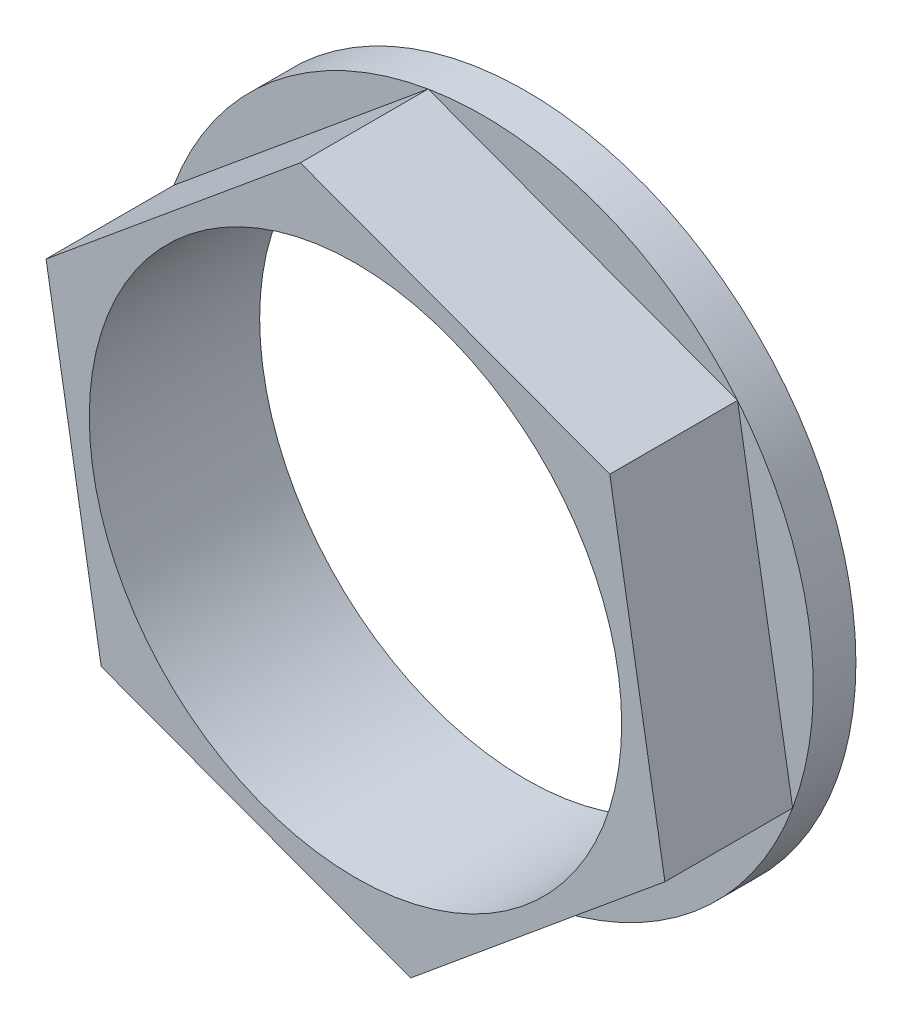
ISO-10303-21;
HEADER;
FILE_DESCRIPTION(('STEP AP214'),'2;1');
FILE_NAME('part.step','',(''),(''),'','','');
FILE_SCHEMA(('AUTOMOTIVE_DESIGN { 1 0 10303 214 1 1 1 1 }'));
ENDSEC;
DATA;
#1=APPLICATION_CONTEXT('core data for automotive mechanical design processes');
#2=APPLICATION_PROTOCOL_DEFINITION('international standard','automotive_design',2000,#1);
#3=PRODUCT_CONTEXT('',#1,'mechanical');
#4=PRODUCT('Part','Part','',(#3));
#5=PRODUCT_RELATED_PRODUCT_CATEGORY('part','',(#4));
#6=PRODUCT_DEFINITION_FORMATION('','',#4);
#7=PRODUCT_DEFINITION_CONTEXT('part definition',#1,'design');
#8=PRODUCT_DEFINITION('design','',#6,#7);
#9=PRODUCT_DEFINITION_SHAPE('','',#8);
#10=(LENGTH_UNIT() NAMED_UNIT(*) SI_UNIT(.MILLI.,.METRE.));
#11=(NAMED_UNIT(*) PLANE_ANGLE_UNIT() SI_UNIT($,.RADIAN.));
#12=(NAMED_UNIT(*) SI_UNIT($,.STERADIAN.) SOLID_ANGLE_UNIT());
#13=UNCERTAINTY_MEASURE_WITH_UNIT(LENGTH_MEASURE(1.E-05),#10,'distance_accuracy_value','');
#14=(GEOMETRIC_REPRESENTATION_CONTEXT(3) GLOBAL_UNCERTAINTY_ASSIGNED_CONTEXT((#13)) GLOBAL_UNIT_ASSIGNED_CONTEXT((#10,
#11,#12)) REPRESENTATION_CONTEXT('',''));
#15=CARTESIAN_POINT('',(0.,0.,0.));
#16=DIRECTION('',(0.,0.,1.));
#17=DIRECTION('',(1.,0.,0.));
#18=AXIS2_PLACEMENT_3D('',#15,#16,#17);
#19=CARTESIAN_POINT('',(0.,0.,1.));
#20=DIRECTION('',(0.,0.,1.));
#21=DIRECTION('',(1.,0.,0.));
#22=AXIS2_PLACEMENT_3D('',#19,#20,#21);
#23=PLANE('',#22);
#24=DIRECTION('',(-0.77035918816092,-0.63761016398427,0.));
#25=VECTOR('',#24,1.);
#26=CARTESIAN_POINT('',(-1.29430429371837,7.64115674458142,1.));
#27=LINE('',#26,#25);
#28=CARTESIAN_POINT('',(-1.29430429371837,7.64115674458142,1.));
#29=VERTEX_POINT('',#28);
#30=CARTESIAN_POINT('',(-7.2645880019655,2.69967797370333,1.));
#31=VERTEX_POINT('',#30);
#32=EDGE_CURVE('E125',#29,#31,#27,.T.);
#33=ORIENTED_EDGE('',*,*,#32,.F.);
#34=CARTESIAN_POINT('',(0.,0.,1.));
#35=DIRECTION('',(0.,0.,1.));
#36=DIRECTION('',(1.,0.,0.));
#37=AXIS2_PLACEMENT_3D('',#34,#35,#36);
#38=CIRCLE('',#37,7.75);
#39=EDGE_CURVE('E52',#29,#31,#38,.T.);
#40=ORIENTED_EDGE('',*,*,#39,.T.);
#41=EDGE_LOOP('',(#33,#40));
#42=FACE_BOUND('',#41,.T.);
#43=ADVANCED_FACE('F43',(#42),#23,.T.);
#44=DIRECTION('',(-0.937366193802,0.348345544993978,0.));
#45=VECTOR('',#44,1.);
#46=CARTESIAN_POINT('',(5.97028370824713,4.94147877087809,1.));
#47=LINE('',#46,#45);
#48=CARTESIAN_POINT('',(5.97028370824713,4.94147877087809,1.));
#49=VERTEX_POINT('',#48);
#50=EDGE_CURVE('E122',#49,#29,#47,.T.);
#51=ORIENTED_EDGE('',*,*,#50,.F.);
#52=EDGE_CURVE('E11',#49,#29,#38,.T.);
#53=ORIENTED_EDGE('',*,*,#52,.T.);
#54=EDGE_LOOP('',(#51,#53));
#55=FACE_BOUND('',#54,.T.);
#56=ADVANCED_FACE('F175',(#55),#23,.T.);
#57=DIRECTION('',(-0.167007005641079,0.985955708978249,0.));
#58=VECTOR('',#57,1.);
#59=CARTESIAN_POINT('',(7.2645880019655,-2.69967797370333,1.));
#60=LINE('',#59,#58);
#61=CARTESIAN_POINT('',(7.2645880019655,-2.69967797370332,1.));
#62=VERTEX_POINT('',#61);
#63=EDGE_CURVE('E59',#62,#49,#60,.T.);
#64=ORIENTED_EDGE('',*,*,#63,.F.);
#65=EDGE_CURVE('E53',#62,#49,#38,.T.);
#66=ORIENTED_EDGE('',*,*,#65,.T.);
#67=EDGE_LOOP('',(#64,#66));
#68=FACE_BOUND('',#67,.T.);
#69=ADVANCED_FACE('F182',(#68),#23,.T.);
#70=DIRECTION('',(0.77035918816092,0.63761016398427,0.));
#71=VECTOR('',#70,1.);
#72=CARTESIAN_POINT('',(1.29430429371837,-7.64115674458142,1.));
#73=LINE('',#72,#71);
#74=CARTESIAN_POINT('',(1.29430429371837,-7.64115674458142,1.));
#75=VERTEX_POINT('',#74);
#76=EDGE_CURVE('E66',#75,#62,#73,.T.);
#77=ORIENTED_EDGE('',*,*,#76,.F.);
#78=EDGE_CURVE('E206',#75,#62,#38,.T.);
#79=ORIENTED_EDGE('',*,*,#78,.T.);
#80=EDGE_LOOP('',(#77,#79));
#81=FACE_BOUND('',#80,.T.);
#82=ADVANCED_FACE('F193',(#81),#23,.T.);
#83=DIRECTION('',(0.937366193802,-0.348345544993978,0.));
#84=VECTOR('',#83,1.);
#85=CARTESIAN_POINT('',(-5.97028370824713,-4.94147877087809,1.));
#86=LINE('',#85,#84);
#87=CARTESIAN_POINT('',(-5.97028370824713,-4.94147877087809,1.));
#88=VERTEX_POINT('',#87);
#89=EDGE_CURVE('E147',#88,#75,#86,.T.);
#90=ORIENTED_EDGE('',*,*,#89,.F.);
#91=EDGE_CURVE('E204',#88,#75,#38,.T.);
#92=ORIENTED_EDGE('',*,*,#91,.T.);
#93=EDGE_LOOP('',(#90,#92));
#94=FACE_BOUND('',#93,.T.);
#95=ADVANCED_FACE('F186',(#94),#23,.T.);
#96=DIRECTION('',(0.16700700564108,-0.985955708978248,0.));
#97=VECTOR('',#96,1.);
#98=CARTESIAN_POINT('',(-7.2645880019655,2.69967797370333,1.));
#99=LINE('',#98,#97);
#100=EDGE_CURVE('E150',#31,#88,#99,.T.);
#101=ORIENTED_EDGE('',*,*,#100,.F.);
#102=EDGE_CURVE('E196',#31,#88,#38,.T.);
#103=ORIENTED_EDGE('',*,*,#102,.T.);
#104=EDGE_LOOP('',(#101,#103));
#105=FACE_BOUND('',#104,.T.);
#106=ADVANCED_FACE('F178',(#105),#23,.T.);
#107=CARTESIAN_POINT('',(0.,0.,0.));
#108=DIRECTION('',(0.,0.,1.));
#109=DIRECTION('',(1.,0.,0.));
#110=AXIS2_PLACEMENT_3D('',#107,#108,#109);
#111=PLANE('',#110);
#112=CARTESIAN_POINT('',(0.,0.,0.));
#113=DIRECTION('',(0.,0.,1.));
#114=DIRECTION('',(1.,0.,0.));
#115=AXIS2_PLACEMENT_3D('',#112,#113,#114);
#116=CIRCLE('',#115,7.75);
#117=CARTESIAN_POINT('',(7.75,0.,0.));
#118=VERTEX_POINT('',#117);
#119=EDGE_CURVE('E47',#118,#118,#116,.T.);
#120=ORIENTED_EDGE('',*,*,#119,.F.);
#121=EDGE_LOOP('',(#120));
#122=FACE_BOUND('',#121,.T.);
#123=CARTESIAN_POINT('',(0.,0.,0.));
#124=DIRECTION('',(0.,0.,1.));
#125=DIRECTION('',(1.,0.,0.));
#126=AXIS2_PLACEMENT_3D('',#123,#124,#125);
#127=CIRCLE('',#126,6.25);
#128=CARTESIAN_POINT('',(6.25,0.,0.));
#129=VERTEX_POINT('',#128);
#130=EDGE_CURVE('E126',#129,#129,#127,.T.);
#131=ORIENTED_EDGE('',*,*,#130,.T.);
#132=EDGE_LOOP('',(#131));
#133=FACE_BOUND('',#132,.T.);
#134=ADVANCED_FACE('F185',(#122,#133),#111,.F.);
#135=CARTESIAN_POINT('',(0.,0.,1.));
#136=DIRECTION('',(0.,0.,-1.));
#137=DIRECTION('',(-1.,0.,0.));
#138=AXIS2_PLACEMENT_3D('',#135,#136,#137);
#139=CYLINDRICAL_SURFACE('',#138,7.75);
#140=ORIENTED_EDGE('',*,*,#52,.F.);
#141=ORIENTED_EDGE('',*,*,#65,.F.);
#142=ORIENTED_EDGE('',*,*,#78,.F.);
#143=ORIENTED_EDGE('',*,*,#91,.F.);
#144=ORIENTED_EDGE('',*,*,#102,.F.);
#145=ORIENTED_EDGE('',*,*,#39,.F.);
#146=EDGE_LOOP('',(#140,#141,#142,#143,#144,#145));
#147=FACE_BOUND('',#146,.T.);
#148=ORIENTED_EDGE('',*,*,#119,.T.);
#149=EDGE_LOOP('',(#148));
#150=FACE_BOUND('',#149,.T.);
#151=ADVANCED_FACE('F45',(#147,#150),#139,.T.);
#152=CARTESIAN_POINT('',(0.,0.,1.));
#153=DIRECTION('',(0.,0.,-1.));
#154=DIRECTION('',(-1.,0.,0.));
#155=AXIS2_PLACEMENT_3D('',#152,#153,#154);
#156=CYLINDRICAL_SURFACE('',#155,6.25);
#157=ORIENTED_EDGE('',*,*,#130,.F.);
#158=EDGE_LOOP('',(#157));
#159=FACE_BOUND('',#158,.T.);
#160=CARTESIAN_POINT('',(0.,0.,4.));
#161=DIRECTION('',(0.,0.,1.));
#162=DIRECTION('',(1.,0.,0.));
#163=AXIS2_PLACEMENT_3D('',#160,#161,#162);
#164=CIRCLE('',#163,6.25);
#165=CARTESIAN_POINT('',(6.25,0.,4.));
#166=VERTEX_POINT('',#165);
#167=EDGE_CURVE('E153',#166,#166,#164,.T.);
#168=ORIENTED_EDGE('',*,*,#167,.T.);
#169=EDGE_LOOP('',(#168));
#170=FACE_BOUND('',#169,.T.);
#171=ADVANCED_FACE('F163',(#159,#170),#156,.F.);
#172=CARTESIAN_POINT('',(0.,0.,4.));
#173=DIRECTION('',(0.,0.,1.));
#174=DIRECTION('',(1.,0.,0.));
#175=AXIS2_PLACEMENT_3D('',#172,#173,#174);
#176=PLANE('',#175);
#177=DIRECTION('',(-0.77035918816092,-0.63761016398427,0.));
#178=VECTOR('',#177,1.);
#179=CARTESIAN_POINT('',(-1.29430429371837,7.64115674458142,4.));
#180=LINE('',#179,#178);
#181=CARTESIAN_POINT('',(-1.29430429371837,7.64115674458142,4.));
#182=VERTEX_POINT('',#181);
#183=CARTESIAN_POINT('',(-7.2645880019655,2.69967797370333,4.));
#184=VERTEX_POINT('',#183);
#185=EDGE_CURVE('E112',#182,#184,#180,.T.);
#186=ORIENTED_EDGE('',*,*,#185,.T.);
#187=DIRECTION('',(0.16700700564108,-0.985955708978248,0.));
#188=VECTOR('',#187,1.);
#189=CARTESIAN_POINT('',(-7.2645880019655,2.69967797370333,4.));
#190=LINE('',#189,#188);
#191=CARTESIAN_POINT('',(-5.97028370824713,-4.94147877087809,4.));
#192=VERTEX_POINT('',#191);
#193=EDGE_CURVE('E100',#184,#192,#190,.T.);
#194=ORIENTED_EDGE('',*,*,#193,.T.);
#195=DIRECTION('',(0.937366193802,-0.348345544993978,0.));
#196=VECTOR('',#195,1.);
#197=CARTESIAN_POINT('',(-5.97028370824713,-4.94147877087809,4.));
#198=LINE('',#197,#196);
#199=CARTESIAN_POINT('',(1.29430429371837,-7.64115674458142,4.));
#200=VERTEX_POINT('',#199);
#201=EDGE_CURVE('E111',#192,#200,#198,.T.);
#202=ORIENTED_EDGE('',*,*,#201,.T.);
#203=DIRECTION('',(0.77035918816092,0.63761016398427,0.));
#204=VECTOR('',#203,1.);
#205=CARTESIAN_POINT('',(1.29430429371837,-7.64115674458142,4.));
#206=LINE('',#205,#204);
#207=CARTESIAN_POINT('',(7.2645880019655,-2.69967797370333,4.));
#208=VERTEX_POINT('',#207);
#209=EDGE_CURVE('E157',#200,#208,#206,.T.);
#210=ORIENTED_EDGE('',*,*,#209,.T.);
#211=DIRECTION('',(-0.167007005641079,0.985955708978249,0.));
#212=VECTOR('',#211,1.);
#213=CARTESIAN_POINT('',(7.2645880019655,-2.69967797370333,4.));
#214=LINE('',#213,#212);
#215=CARTESIAN_POINT('',(5.97028370824713,4.94147877087809,4.));
#216=VERTEX_POINT('',#215);
#217=EDGE_CURVE('E155',#208,#216,#214,.T.);
#218=ORIENTED_EDGE('',*,*,#217,.T.);
#219=DIRECTION('',(-0.937366193802,0.348345544993978,0.));
#220=VECTOR('',#219,1.);
#221=CARTESIAN_POINT('',(5.97028370824713,4.94147877087809,4.));
#222=LINE('',#221,#220);
#223=EDGE_CURVE('E118',#216,#182,#222,.T.);
#224=ORIENTED_EDGE('',*,*,#223,.T.);
#225=EDGE_LOOP('',(#186,#194,#202,#210,#218,#224));
#226=FACE_BOUND('',#225,.T.);
#227=ORIENTED_EDGE('',*,*,#167,.F.);
#228=EDGE_LOOP('',(#227));
#229=FACE_BOUND('',#228,.T.);
#230=ADVANCED_FACE('F115',(#226,#229),#176,.T.);
#231=CARTESIAN_POINT('',(-1.29430429371837,7.64115674458142,4.));
#232=DIRECTION('',(0.63761016398427,-0.77035918816092,0.));
#233=DIRECTION('',(0.77035918816092,0.63761016398427,0.));
#234=AXIS2_PLACEMENT_3D('',#231,#232,#233);
#235=PLANE('',#234);
#236=ORIENTED_EDGE('',*,*,#32,.T.);
#237=DIRECTION('',(0.,0.,-1.));
#238=VECTOR('',#237,1.);
#239=CARTESIAN_POINT('',(-7.2645880019655,2.69967797370333,4.));
#240=LINE('',#239,#238);
#241=EDGE_CURVE('E105',#184,#31,#240,.T.);
#242=ORIENTED_EDGE('',*,*,#241,.F.);
#243=ORIENTED_EDGE('',*,*,#185,.F.);
#244=DIRECTION('',(0.,0.,-1.));
#245=VECTOR('',#244,1.);
#246=CARTESIAN_POINT('',(-1.29430429371837,7.64115674458142,4.));
#247=LINE('',#246,#245);
#248=EDGE_CURVE('E141',#182,#29,#247,.T.);
#249=ORIENTED_EDGE('',*,*,#248,.T.);
#250=EDGE_LOOP('',(#236,#242,#243,#249));
#251=FACE_BOUND('',#250,.T.);
#252=ADVANCED_FACE('F124',(#251),#235,.F.);
#253=CARTESIAN_POINT('',(-7.2645880019655,2.69967797370333,4.));
#254=DIRECTION('',(0.985955708978248,0.16700700564108,0.));
#255=DIRECTION('',(-0.16700700564108,0.985955708978248,0.));
#256=AXIS2_PLACEMENT_3D('',#253,#254,#255);
#257=PLANE('',#256);
#258=ORIENTED_EDGE('',*,*,#100,.T.);
#259=DIRECTION('',(0.,0.,-1.));
#260=VECTOR('',#259,1.);
#261=CARTESIAN_POINT('',(-5.97028370824713,-4.94147877087809,4.));
#262=LINE('',#261,#260);
#263=EDGE_CURVE('E108',#192,#88,#262,.T.);
#264=ORIENTED_EDGE('',*,*,#263,.F.);
#265=ORIENTED_EDGE('',*,*,#193,.F.);
#266=ORIENTED_EDGE('',*,*,#241,.T.);
#267=EDGE_LOOP('',(#258,#264,#265,#266));
#268=FACE_BOUND('',#267,.T.);
#269=ADVANCED_FACE('F103',(#268),#257,.F.);
#270=CARTESIAN_POINT('',(-5.97028370824713,-4.94147877087809,4.));
#271=DIRECTION('',(0.348345544993978,0.937366193802,0.));
#272=DIRECTION('',(-0.937366193802,0.348345544993978,0.));
#273=AXIS2_PLACEMENT_3D('',#270,#271,#272);
#274=PLANE('',#273);
#275=ORIENTED_EDGE('',*,*,#89,.T.);
#276=DIRECTION('',(0.,0.,-1.));
#277=VECTOR('',#276,1.);
#278=CARTESIAN_POINT('',(1.29430429371837,-7.64115674458142,4.));
#279=LINE('',#278,#277);
#280=EDGE_CURVE('E130',#200,#75,#279,.T.);
#281=ORIENTED_EDGE('',*,*,#280,.F.);
#282=ORIENTED_EDGE('',*,*,#201,.F.);
#283=ORIENTED_EDGE('',*,*,#263,.T.);
#284=EDGE_LOOP('',(#275,#281,#282,#283));
#285=FACE_BOUND('',#284,.T.);
#286=ADVANCED_FACE('F239',(#285),#274,.F.);
#287=CARTESIAN_POINT('',(1.29430429371837,-7.64115674458142,4.));
#288=DIRECTION('',(-0.63761016398427,0.77035918816092,0.));
#289=DIRECTION('',(-0.77035918816092,-0.63761016398427,0.));
#290=AXIS2_PLACEMENT_3D('',#287,#288,#289);
#291=PLANE('',#290);
#292=ORIENTED_EDGE('',*,*,#76,.T.);
#293=DIRECTION('',(0.,0.,-1.));
#294=VECTOR('',#293,1.);
#295=CARTESIAN_POINT('',(7.2645880019655,-2.69967797370333,4.));
#296=LINE('',#295,#294);
#297=EDGE_CURVE('E135',#208,#62,#296,.T.);
#298=ORIENTED_EDGE('',*,*,#297,.F.);
#299=ORIENTED_EDGE('',*,*,#209,.F.);
#300=ORIENTED_EDGE('',*,*,#280,.T.);
#301=EDGE_LOOP('',(#292,#298,#299,#300));
#302=FACE_BOUND('',#301,.T.);
#303=ADVANCED_FACE('F248',(#302),#291,.F.);
#304=CARTESIAN_POINT('',(7.2645880019655,-2.69967797370333,4.));
#305=DIRECTION('',(-0.985955708978248,-0.167007005641079,0.));
#306=DIRECTION('',(0.167007005641079,-0.985955708978248,0.));
#307=AXIS2_PLACEMENT_3D('',#304,#305,#306);
#308=PLANE('',#307);
#309=ORIENTED_EDGE('',*,*,#63,.T.);
#310=DIRECTION('',(0.,0.,-1.));
#311=VECTOR('',#310,1.);
#312=CARTESIAN_POINT('',(5.97028370824713,4.94147877087809,4.));
#313=LINE('',#312,#311);
#314=EDGE_CURVE('E138',#216,#49,#313,.T.);
#315=ORIENTED_EDGE('',*,*,#314,.F.);
#316=ORIENTED_EDGE('',*,*,#217,.F.);
#317=ORIENTED_EDGE('',*,*,#297,.T.);
#318=EDGE_LOOP('',(#309,#315,#316,#317));
#319=FACE_BOUND('',#318,.T.);
#320=ADVANCED_FACE('F258',(#319),#308,.F.);
#321=CARTESIAN_POINT('',(5.97028370824713,4.94147877087809,4.));
#322=DIRECTION('',(-0.348345544993978,-0.937366193802,0.));
#323=DIRECTION('',(0.937366193802,-0.348345544993978,0.));
#324=AXIS2_PLACEMENT_3D('',#321,#322,#323);
#325=PLANE('',#324);
#326=ORIENTED_EDGE('',*,*,#50,.T.);
#327=ORIENTED_EDGE('',*,*,#248,.F.);
#328=ORIENTED_EDGE('',*,*,#223,.F.);
#329=ORIENTED_EDGE('',*,*,#314,.T.);
#330=EDGE_LOOP('',(#326,#327,#328,#329));
#331=FACE_BOUND('',#330,.T.);
#332=ADVANCED_FACE('F268',(#331),#325,.F.);
#333=CLOSED_SHELL('',(#43,#56,#69,#82,#95,#106,#134,#151,#171,#230,#252,#269,#286,#303,#320,#332));
#334=MANIFOLD_SOLID_BREP('B2',#333);
#335=ADVANCED_BREP_SHAPE_REPRESENTATION('',(#18,#334),#14);
#336=SHAPE_DEFINITION_REPRESENTATION(#9,#335);
ENDSEC;
END-ISO-10303-21;
